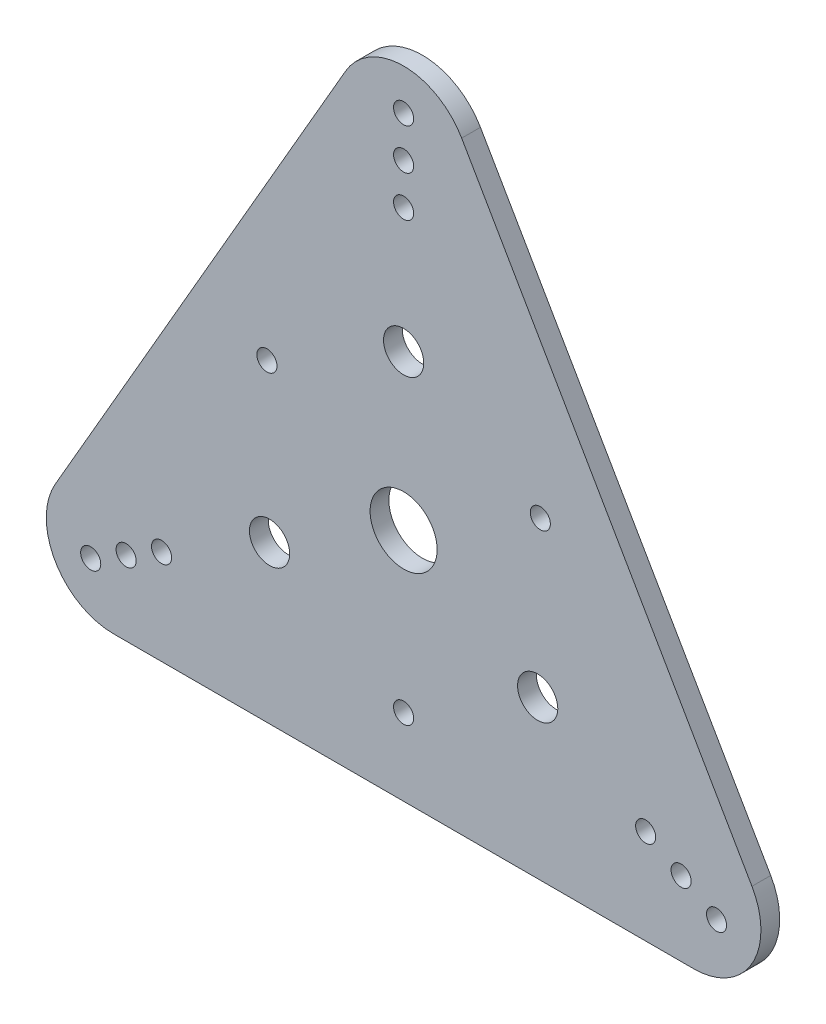
ISO-10303-21;
HEADER;
FILE_DESCRIPTION(('STEP AP214'),'2;1');
FILE_NAME('part.step','',(''),(''),'','','');
FILE_SCHEMA(('AUTOMOTIVE_DESIGN { 1 0 10303 214 1 1 1 1 }'));
ENDSEC;
DATA;
#1=APPLICATION_CONTEXT('core data for automotive mechanical design processes');
#2=APPLICATION_PROTOCOL_DEFINITION('international standard','automotive_design',2000,#1);
#3=PRODUCT_CONTEXT('',#1,'mechanical');
#4=PRODUCT('Part','Part','',(#3));
#5=PRODUCT_RELATED_PRODUCT_CATEGORY('part','',(#4));
#6=PRODUCT_DEFINITION_FORMATION('','',#4);
#7=PRODUCT_DEFINITION_CONTEXT('part definition',#1,'design');
#8=PRODUCT_DEFINITION('design','',#6,#7);
#9=PRODUCT_DEFINITION_SHAPE('','',#8);
#10=(LENGTH_UNIT() NAMED_UNIT(*) SI_UNIT(.MILLI.,.METRE.));
#11=(NAMED_UNIT(*) PLANE_ANGLE_UNIT() SI_UNIT($,.RADIAN.));
#12=(NAMED_UNIT(*) SI_UNIT($,.STERADIAN.) SOLID_ANGLE_UNIT());
#13=UNCERTAINTY_MEASURE_WITH_UNIT(LENGTH_MEASURE(1.E-05),#10,'distance_accuracy_value','');
#14=(GEOMETRIC_REPRESENTATION_CONTEXT(3) GLOBAL_UNCERTAINTY_ASSIGNED_CONTEXT((#13)) GLOBAL_UNIT_ASSIGNED_CONTEXT((#10,
#11,#12)) REPRESENTATION_CONTEXT('',''));
#15=CARTESIAN_POINT('',(0.,0.,0.));
#16=DIRECTION('',(0.,0.,1.));
#17=DIRECTION('',(1.,0.,0.));
#18=AXIS2_PLACEMENT_3D('',#15,#16,#17);
#19=CARTESIAN_POINT('',(-43.3012701892219,-37.5,2.8));
#20=DIRECTION('',(0.,0.,1.));
#21=DIRECTION('',(1.,0.,0.));
#22=AXIS2_PLACEMENT_3D('',#19,#20,#21);
#23=PLANE('',#22);
#24=CARTESIAN_POINT('',(19.9965265733827,-24.045,2.8));
#25=DIRECTION('',(0.,0.,1.));
#26=DIRECTION('',(1.,0.,0.));
#27=AXIS2_PLACEMENT_3D('',#24,#25,#26);
#28=CIRCLE('',#27,3.);
#29=CARTESIAN_POINT('',(22.9965265733827,-24.045,2.8));
#30=VERTEX_POINT('',#29);
#31=EDGE_CURVE('E240',#30,#30,#28,.T.);
#32=ORIENTED_EDGE('',*,*,#31,.F.);
#33=EDGE_LOOP('',(#32));
#34=FACE_BOUND('',#33,.T.);
#35=CARTESIAN_POINT('',(0.,10.59,2.8));
#36=DIRECTION('',(0.,0.,1.));
#37=DIRECTION('',(1.,0.,0.));
#38=AXIS2_PLACEMENT_3D('',#35,#36,#37);
#39=CIRCLE('',#38,3.);
#40=CARTESIAN_POINT('',(3.00000000000001,10.59,2.8));
#41=VERTEX_POINT('',#40);
#42=EDGE_CURVE('E252',#41,#41,#39,.T.);
#43=ORIENTED_EDGE('',*,*,#42,.F.);
#44=EDGE_LOOP('',(#43));
#45=FACE_BOUND('',#44,.T.);
#46=CARTESIAN_POINT('',(41.3916841738772,-36.3975,2.8));
#47=DIRECTION('',(0.,0.,1.));
#48=DIRECTION('',(1.,0.,0.));
#49=AXIS2_PLACEMENT_3D('',#46,#47,#48);
#50=CIRCLE('',#49,1.5);
#51=CARTESIAN_POINT('',(42.8916841738772,-36.3975,2.8));
#52=VERTEX_POINT('',#51);
#53=EDGE_CURVE('E264',#52,#52,#50,.T.);
#54=ORIENTED_EDGE('',*,*,#53,.F.);
#55=EDGE_LOOP('',(#54));
#56=FACE_BOUND('',#55,.T.);
#57=CARTESIAN_POINT('',(-36.1067641472827,-33.34625,2.8));
#58=DIRECTION('',(0.,0.,1.));
#59=DIRECTION('',(1.,0.,0.));
#60=AXIS2_PLACEMENT_3D('',#57,#58,#59);
#61=CIRCLE('',#60,1.5);
#62=CARTESIAN_POINT('',(-34.6067641472827,-33.34625,2.8));
#63=VERTEX_POINT('',#62);
#64=EDGE_CURVE('E276',#63,#63,#61,.T.);
#65=ORIENTED_EDGE('',*,*,#64,.F.);
#66=EDGE_LOOP('',(#65));
#67=FACE_BOUND('',#66,.T.);
#68=CARTESIAN_POINT('',(-46.6766042004718,-39.44875,2.8));
#69=DIRECTION('',(0.,0.,1.));
#70=DIRECTION('',(1.,0.,0.));
#71=AXIS2_PLACEMENT_3D('',#68,#69,#70);
#72=CIRCLE('',#71,1.5);
#73=CARTESIAN_POINT('',(-45.1766042004718,-39.44875,2.8));
#74=VERTEX_POINT('',#73);
#75=EDGE_CURVE('E288',#74,#74,#72,.T.);
#76=ORIENTED_EDGE('',*,*,#75,.F.);
#77=EDGE_LOOP('',(#76));
#78=FACE_BOUND('',#77,.T.);
#79=CARTESIAN_POINT('',(0.,35.295,2.8));
#80=DIRECTION('',(0.,0.,1.));
#81=DIRECTION('',(1.,0.,0.));
#82=AXIS2_PLACEMENT_3D('',#79,#80,#81);
#83=CIRCLE('',#82,1.5);
#84=CARTESIAN_POINT('',(1.49999999999999,35.295,2.8));
#85=VERTEX_POINT('',#84);
#86=EDGE_CURVE('E300',#85,#85,#83,.T.);
#87=ORIENTED_EDGE('',*,*,#86,.F.);
#88=EDGE_LOOP('',(#87));
#89=FACE_BOUND('',#88,.T.);
#90=CARTESIAN_POINT('',(-20.3905681321046,-0.727499999999985,2.8));
#91=DIRECTION('',(0.,0.,1.));
#92=DIRECTION('',(1.,0.,0.));
#93=AXIS2_PLACEMENT_3D('',#90,#91,#92);
#94=CIRCLE('',#93,1.5);
#95=CARTESIAN_POINT('',(-18.8905681321046,-0.727499999999985,2.8));
#96=VERTEX_POINT('',#95);
#97=EDGE_CURVE('E312',#96,#96,#94,.T.);
#98=ORIENTED_EDGE('',*,*,#97,.F.);
#99=EDGE_LOOP('',(#98));
#100=FACE_BOUND('',#99,.T.);
#101=CARTESIAN_POINT('',(0.,-36.045,2.8));
#102=DIRECTION('',(0.,0.,1.));
#103=DIRECTION('',(1.,0.,0.));
#104=AXIS2_PLACEMENT_3D('',#101,#102,#103);
#105=CIRCLE('',#104,1.5);
#106=CARTESIAN_POINT('',(1.49999999999998,-36.045,2.8));
#107=VERTEX_POINT('',#106);
#108=EDGE_CURVE('E125',#107,#107,#105,.T.);
#109=ORIENTED_EDGE('',*,*,#108,.F.);
#110=EDGE_LOOP('',(#109));
#111=FACE_BOUND('',#110,.T.);
#112=CARTESIAN_POINT('',(-43.3012701892219,-37.5,2.8));
#113=DIRECTION('',(0.,0.,1.));
#114=DIRECTION('',(1.,0.,0.));
#115=AXIS2_PLACEMENT_3D('',#112,#113,#114);
#116=CIRCLE('',#115,10.);
#117=CARTESIAN_POINT('',(-51.9615242270663,-32.5,2.8));
#118=VERTEX_POINT('',#117);
#119=CARTESIAN_POINT('',(-43.3012701892219,-47.5,2.8));
#120=VERTEX_POINT('',#119);
#121=EDGE_CURVE('E132',#118,#120,#116,.T.);
#122=ORIENTED_EDGE('',*,*,#121,.T.);
#123=DIRECTION('',(1.,0.,0.));
#124=VECTOR('',#123,1.);
#125=CARTESIAN_POINT('',(-43.3012701892219,-47.5,2.8));
#126=LINE('',#125,#124);
#127=CARTESIAN_POINT('',(43.3012701892219,-47.5,2.8));
#128=VERTEX_POINT('',#127);
#129=EDGE_CURVE('E90',#120,#128,#126,.T.);
#130=ORIENTED_EDGE('',*,*,#129,.T.);
#131=CARTESIAN_POINT('',(43.3012701892219,-37.5,2.8));
#132=DIRECTION('',(0.,0.,1.));
#133=DIRECTION('',(1.,0.,0.));
#134=AXIS2_PLACEMENT_3D('',#131,#132,#133);
#135=CIRCLE('',#134,10.);
#136=CARTESIAN_POINT('',(51.9615242270663,-32.5,2.8));
#137=VERTEX_POINT('',#136);
#138=EDGE_CURVE('E103',#128,#137,#135,.T.);
#139=ORIENTED_EDGE('',*,*,#138,.T.);
#140=DIRECTION('',(-0.5,0.866025403784439,0.));
#141=VECTOR('',#140,1.);
#142=CARTESIAN_POINT('',(51.9615242270663,-32.5,2.8));
#143=LINE('',#142,#141);
#144=CARTESIAN_POINT('',(8.66025403784438,42.5,2.8));
#145=VERTEX_POINT('',#144);
#146=EDGE_CURVE('E97',#137,#145,#143,.T.);
#147=ORIENTED_EDGE('',*,*,#146,.T.);
#148=CARTESIAN_POINT('',(0.,37.5,2.8));
#149=DIRECTION('',(0.,0.,1.));
#150=DIRECTION('',(1.,0.,0.));
#151=AXIS2_PLACEMENT_3D('',#148,#149,#150);
#152=CIRCLE('',#151,10.);
#153=CARTESIAN_POINT('',(-8.66025403784439,42.5,2.8));
#154=VERTEX_POINT('',#153);
#155=EDGE_CURVE('E101',#145,#154,#152,.T.);
#156=ORIENTED_EDGE('',*,*,#155,.T.);
#157=DIRECTION('',(-0.5,-0.866025403784439,0.));
#158=VECTOR('',#157,1.);
#159=CARTESIAN_POINT('',(-8.66025403784439,42.5,2.8));
#160=LINE('',#159,#158);
#161=EDGE_CURVE('E53',#154,#118,#160,.T.);
#162=ORIENTED_EDGE('',*,*,#161,.T.);
#163=EDGE_LOOP('',(#122,#130,#139,#147,#156,#162));
#164=FACE_BOUND('',#163,.T.);
#165=CARTESIAN_POINT('',(20.3905681321046,-0.727499999999985,2.8));
#166=DIRECTION('',(0.,0.,1.));
#167=DIRECTION('',(1.,0.,0.));
#168=AXIS2_PLACEMENT_3D('',#165,#166,#167);
#169=CIRCLE('',#168,1.5);
#170=CARTESIAN_POINT('',(21.8905681321046,-0.727499999999985,2.8));
#171=VERTEX_POINT('',#170);
#172=EDGE_CURVE('E318',#171,#171,#169,.T.);
#173=ORIENTED_EDGE('',*,*,#172,.F.);
#174=EDGE_LOOP('',(#173));
#175=FACE_BOUND('',#174,.T.);
#176=CARTESIAN_POINT('',(0.,41.3975,2.8));
#177=DIRECTION('',(0.,0.,1.));
#178=DIRECTION('',(1.,0.,0.));
#179=AXIS2_PLACEMENT_3D('',#176,#177,#178);
#180=CIRCLE('',#179,1.5);
#181=CARTESIAN_POINT('',(1.49999999999999,41.3975,2.8));
#182=VERTEX_POINT('',#181);
#183=EDGE_CURVE('E306',#182,#182,#180,.T.);
#184=ORIENTED_EDGE('',*,*,#183,.F.);
#185=EDGE_LOOP('',(#184));
#186=FACE_BOUND('',#185,.T.);
#187=CARTESIAN_POINT('',(0.,29.1925,2.8));
#188=DIRECTION('',(0.,0.,1.));
#189=DIRECTION('',(1.,0.,0.));
#190=AXIS2_PLACEMENT_3D('',#187,#188,#189);
#191=CIRCLE('',#190,1.5);
#192=CARTESIAN_POINT('',(1.49999999999999,29.1925,2.8));
#193=VERTEX_POINT('',#192);
#194=EDGE_CURVE('E294',#193,#193,#191,.T.);
#195=ORIENTED_EDGE('',*,*,#194,.F.);
#196=EDGE_LOOP('',(#195));
#197=FACE_BOUND('',#196,.T.);
#198=CARTESIAN_POINT('',(-41.3916841738772,-36.3975,2.8));
#199=DIRECTION('',(0.,0.,1.));
#200=DIRECTION('',(1.,0.,0.));
#201=AXIS2_PLACEMENT_3D('',#198,#199,#200);
#202=CIRCLE('',#201,1.49999999999999);
#203=CARTESIAN_POINT('',(-39.8916841738773,-36.3975,2.8));
#204=VERTEX_POINT('',#203);
#205=EDGE_CURVE('E282',#204,#204,#202,.T.);
#206=ORIENTED_EDGE('',*,*,#205,.F.);
#207=EDGE_LOOP('',(#206));
#208=FACE_BOUND('',#207,.T.);
#209=CARTESIAN_POINT('',(46.6766042004718,-39.44875,2.8));
#210=DIRECTION('',(0.,0.,1.));
#211=DIRECTION('',(1.,0.,0.));
#212=AXIS2_PLACEMENT_3D('',#209,#210,#211);
#213=CIRCLE('',#212,1.5);
#214=CARTESIAN_POINT('',(48.1766042004718,-39.44875,2.8));
#215=VERTEX_POINT('',#214);
#216=EDGE_CURVE('E270',#215,#215,#213,.T.);
#217=ORIENTED_EDGE('',*,*,#216,.F.);
#218=EDGE_LOOP('',(#217));
#219=FACE_BOUND('',#218,.T.);
#220=CARTESIAN_POINT('',(36.1067641472827,-33.34625,2.8));
#221=DIRECTION('',(0.,0.,1.));
#222=DIRECTION('',(1.,0.,0.));
#223=AXIS2_PLACEMENT_3D('',#220,#221,#222);
#224=CIRCLE('',#223,1.5);
#225=CARTESIAN_POINT('',(37.6067641472827,-33.34625,2.8));
#226=VERTEX_POINT('',#225);
#227=EDGE_CURVE('E258',#226,#226,#224,.T.);
#228=ORIENTED_EDGE('',*,*,#227,.F.);
#229=EDGE_LOOP('',(#228));
#230=FACE_BOUND('',#229,.T.);
#231=CARTESIAN_POINT('',(-19.9965265733827,-24.045,2.8));
#232=DIRECTION('',(0.,0.,1.));
#233=DIRECTION('',(1.,0.,0.));
#234=AXIS2_PLACEMENT_3D('',#231,#232,#233);
#235=CIRCLE('',#234,3.);
#236=CARTESIAN_POINT('',(-16.9965265733827,-24.045,2.8));
#237=VERTEX_POINT('',#236);
#238=EDGE_CURVE('E246',#237,#237,#235,.T.);
#239=ORIENTED_EDGE('',*,*,#238,.F.);
#240=EDGE_LOOP('',(#239));
#241=FACE_BOUND('',#240,.T.);
#242=CARTESIAN_POINT('',(0.,-12.5,2.8));
#243=DIRECTION('',(0.,0.,1.));
#244=DIRECTION('',(1.,0.,0.));
#245=AXIS2_PLACEMENT_3D('',#242,#243,#244);
#246=CIRCLE('',#245,5.);
#247=CARTESIAN_POINT('',(5.,-12.5,2.8));
#248=VERTEX_POINT('',#247);
#249=EDGE_CURVE('E231',#248,#248,#246,.T.);
#250=ORIENTED_EDGE('',*,*,#249,.F.);
#251=EDGE_LOOP('',(#250));
#252=FACE_BOUND('',#251,.T.);
#253=ADVANCED_FACE('F36',(#34,#45,#56,#67,#78,#89,#100,#111,#164,#175,#186,#197,#208,#219,#230,
#241,#252),#23,.T.);
#254=CARTESIAN_POINT('',(-43.3012701892219,-37.5,0.));
#255=DIRECTION('',(0.,0.,1.));
#256=DIRECTION('',(1.,0.,0.));
#257=AXIS2_PLACEMENT_3D('',#254,#255,#256);
#258=PLANE('',#257);
#259=CARTESIAN_POINT('',(-43.3012701892219,-37.5,0.));
#260=DIRECTION('',(0.,0.,1.));
#261=DIRECTION('',(1.,0.,0.));
#262=AXIS2_PLACEMENT_3D('',#259,#260,#261);
#263=CIRCLE('',#262,10.);
#264=CARTESIAN_POINT('',(-51.9615242270663,-32.5,0.));
#265=VERTEX_POINT('',#264);
#266=CARTESIAN_POINT('',(-43.3012701892219,-47.5,0.));
#267=VERTEX_POINT('',#266);
#268=EDGE_CURVE('E121',#265,#267,#263,.T.);
#269=ORIENTED_EDGE('',*,*,#268,.F.);
#270=DIRECTION('',(-0.5,-0.866025403784439,0.));
#271=VECTOR('',#270,1.);
#272=CARTESIAN_POINT('',(-8.66025403784439,42.5,0.));
#273=LINE('',#272,#271);
#274=CARTESIAN_POINT('',(-8.66025403784439,42.5,0.));
#275=VERTEX_POINT('',#274);
#276=EDGE_CURVE('E82',#275,#265,#273,.T.);
#277=ORIENTED_EDGE('',*,*,#276,.F.);
#278=CARTESIAN_POINT('',(0.,37.5,0.));
#279=DIRECTION('',(0.,0.,1.));
#280=DIRECTION('',(1.,0.,0.));
#281=AXIS2_PLACEMENT_3D('',#278,#279,#280);
#282=CIRCLE('',#281,10.);
#283=CARTESIAN_POINT('',(8.66025403784438,42.5,0.));
#284=VERTEX_POINT('',#283);
#285=EDGE_CURVE('E76',#284,#275,#282,.T.);
#286=ORIENTED_EDGE('',*,*,#285,.F.);
#287=DIRECTION('',(-0.5,0.866025403784439,0.));
#288=VECTOR('',#287,1.);
#289=CARTESIAN_POINT('',(51.9615242270663,-32.5,0.));
#290=LINE('',#289,#288);
#291=CARTESIAN_POINT('',(51.9615242270663,-32.5,0.));
#292=VERTEX_POINT('',#291);
#293=EDGE_CURVE('E111',#292,#284,#290,.T.);
#294=ORIENTED_EDGE('',*,*,#293,.F.);
#295=CARTESIAN_POINT('',(43.3012701892219,-37.5,0.));
#296=DIRECTION('',(0.,0.,1.));
#297=DIRECTION('',(1.,0.,0.));
#298=AXIS2_PLACEMENT_3D('',#295,#296,#297);
#299=CIRCLE('',#298,10.);
#300=CARTESIAN_POINT('',(43.3012701892219,-47.5,0.));
#301=VERTEX_POINT('',#300);
#302=EDGE_CURVE('E127',#301,#292,#299,.T.);
#303=ORIENTED_EDGE('',*,*,#302,.F.);
#304=DIRECTION('',(1.,0.,0.));
#305=VECTOR('',#304,1.);
#306=CARTESIAN_POINT('',(-43.3012701892219,-47.5,0.));
#307=LINE('',#306,#305);
#308=EDGE_CURVE('E124',#267,#301,#307,.T.);
#309=ORIENTED_EDGE('',*,*,#308,.F.);
#310=EDGE_LOOP('',(#269,#277,#286,#294,#303,#309));
#311=FACE_BOUND('',#310,.T.);
#312=CARTESIAN_POINT('',(0.,-36.045,0.));
#313=DIRECTION('',(0.,0.,1.));
#314=DIRECTION('',(1.,0.,0.));
#315=AXIS2_PLACEMENT_3D('',#312,#313,#314);
#316=CIRCLE('',#315,1.5);
#317=CARTESIAN_POINT('',(1.49999999999998,-36.045,0.));
#318=VERTEX_POINT('',#317);
#319=EDGE_CURVE('E321',#318,#318,#316,.T.);
#320=ORIENTED_EDGE('',*,*,#319,.T.);
#321=EDGE_LOOP('',(#320));
#322=FACE_BOUND('',#321,.T.);
#323=CARTESIAN_POINT('',(20.3905681321046,-0.727499999999985,0.));
#324=DIRECTION('',(0.,0.,1.));
#325=DIRECTION('',(1.,0.,0.));
#326=AXIS2_PLACEMENT_3D('',#323,#324,#325);
#327=CIRCLE('',#326,1.5);
#328=CARTESIAN_POINT('',(21.8905681321046,-0.727499999999985,0.));
#329=VERTEX_POINT('',#328);
#330=EDGE_CURVE('E315',#329,#329,#327,.T.);
#331=ORIENTED_EDGE('',*,*,#330,.T.);
#332=EDGE_LOOP('',(#331));
#333=FACE_BOUND('',#332,.T.);
#334=CARTESIAN_POINT('',(-20.3905681321046,-0.727499999999985,0.));
#335=DIRECTION('',(0.,0.,1.));
#336=DIRECTION('',(1.,0.,0.));
#337=AXIS2_PLACEMENT_3D('',#334,#335,#336);
#338=CIRCLE('',#337,1.5);
#339=CARTESIAN_POINT('',(-18.8905681321046,-0.727499999999985,0.));
#340=VERTEX_POINT('',#339);
#341=EDGE_CURVE('E309',#340,#340,#338,.T.);
#342=ORIENTED_EDGE('',*,*,#341,.T.);
#343=EDGE_LOOP('',(#342));
#344=FACE_BOUND('',#343,.T.);
#345=CARTESIAN_POINT('',(0.,41.3975,0.));
#346=DIRECTION('',(0.,0.,1.));
#347=DIRECTION('',(1.,0.,0.));
#348=AXIS2_PLACEMENT_3D('',#345,#346,#347);
#349=CIRCLE('',#348,1.5);
#350=CARTESIAN_POINT('',(1.49999999999999,41.3975,0.));
#351=VERTEX_POINT('',#350);
#352=EDGE_CURVE('E303',#351,#351,#349,.T.);
#353=ORIENTED_EDGE('',*,*,#352,.T.);
#354=EDGE_LOOP('',(#353));
#355=FACE_BOUND('',#354,.T.);
#356=CARTESIAN_POINT('',(0.,35.295,0.));
#357=DIRECTION('',(0.,0.,1.));
#358=DIRECTION('',(1.,0.,0.));
#359=AXIS2_PLACEMENT_3D('',#356,#357,#358);
#360=CIRCLE('',#359,1.5);
#361=CARTESIAN_POINT('',(1.49999999999999,35.295,0.));
#362=VERTEX_POINT('',#361);
#363=EDGE_CURVE('E297',#362,#362,#360,.T.);
#364=ORIENTED_EDGE('',*,*,#363,.T.);
#365=EDGE_LOOP('',(#364));
#366=FACE_BOUND('',#365,.T.);
#367=CARTESIAN_POINT('',(0.,29.1925,0.));
#368=DIRECTION('',(0.,0.,1.));
#369=DIRECTION('',(1.,0.,0.));
#370=AXIS2_PLACEMENT_3D('',#367,#368,#369);
#371=CIRCLE('',#370,1.5);
#372=CARTESIAN_POINT('',(1.49999999999999,29.1925,0.));
#373=VERTEX_POINT('',#372);
#374=EDGE_CURVE('E291',#373,#373,#371,.T.);
#375=ORIENTED_EDGE('',*,*,#374,.T.);
#376=EDGE_LOOP('',(#375));
#377=FACE_BOUND('',#376,.T.);
#378=CARTESIAN_POINT('',(-46.6766042004718,-39.44875,0.));
#379=DIRECTION('',(0.,0.,1.));
#380=DIRECTION('',(1.,0.,0.));
#381=AXIS2_PLACEMENT_3D('',#378,#379,#380);
#382=CIRCLE('',#381,1.5);
#383=CARTESIAN_POINT('',(-45.1766042004718,-39.44875,0.));
#384=VERTEX_POINT('',#383);
#385=EDGE_CURVE('E285',#384,#384,#382,.T.);
#386=ORIENTED_EDGE('',*,*,#385,.T.);
#387=EDGE_LOOP('',(#386));
#388=FACE_BOUND('',#387,.T.);
#389=CARTESIAN_POINT('',(-41.3916841738772,-36.3975,0.));
#390=DIRECTION('',(0.,0.,1.));
#391=DIRECTION('',(1.,0.,0.));
#392=AXIS2_PLACEMENT_3D('',#389,#390,#391);
#393=CIRCLE('',#392,1.49999999999999);
#394=CARTESIAN_POINT('',(-39.8916841738773,-36.3975,0.));
#395=VERTEX_POINT('',#394);
#396=EDGE_CURVE('E279',#395,#395,#393,.T.);
#397=ORIENTED_EDGE('',*,*,#396,.T.);
#398=EDGE_LOOP('',(#397));
#399=FACE_BOUND('',#398,.T.);
#400=CARTESIAN_POINT('',(-36.1067641472827,-33.34625,0.));
#401=DIRECTION('',(0.,0.,1.));
#402=DIRECTION('',(1.,0.,0.));
#403=AXIS2_PLACEMENT_3D('',#400,#401,#402);
#404=CIRCLE('',#403,1.5);
#405=CARTESIAN_POINT('',(-34.6067641472827,-33.34625,0.));
#406=VERTEX_POINT('',#405);
#407=EDGE_CURVE('E273',#406,#406,#404,.T.);
#408=ORIENTED_EDGE('',*,*,#407,.T.);
#409=EDGE_LOOP('',(#408));
#410=FACE_BOUND('',#409,.T.);
#411=CARTESIAN_POINT('',(46.6766042004718,-39.44875,0.));
#412=DIRECTION('',(0.,0.,1.));
#413=DIRECTION('',(1.,0.,0.));
#414=AXIS2_PLACEMENT_3D('',#411,#412,#413);
#415=CIRCLE('',#414,1.5);
#416=CARTESIAN_POINT('',(48.1766042004718,-39.44875,0.));
#417=VERTEX_POINT('',#416);
#418=EDGE_CURVE('E267',#417,#417,#415,.T.);
#419=ORIENTED_EDGE('',*,*,#418,.T.);
#420=EDGE_LOOP('',(#419));
#421=FACE_BOUND('',#420,.T.);
#422=CARTESIAN_POINT('',(41.3916841738772,-36.3975,0.));
#423=DIRECTION('',(0.,0.,1.));
#424=DIRECTION('',(1.,0.,0.));
#425=AXIS2_PLACEMENT_3D('',#422,#423,#424);
#426=CIRCLE('',#425,1.5);
#427=CARTESIAN_POINT('',(42.8916841738772,-36.3975,0.));
#428=VERTEX_POINT('',#427);
#429=EDGE_CURVE('E261',#428,#428,#426,.T.);
#430=ORIENTED_EDGE('',*,*,#429,.T.);
#431=EDGE_LOOP('',(#430));
#432=FACE_BOUND('',#431,.T.);
#433=CARTESIAN_POINT('',(36.1067641472827,-33.34625,0.));
#434=DIRECTION('',(0.,0.,1.));
#435=DIRECTION('',(1.,0.,0.));
#436=AXIS2_PLACEMENT_3D('',#433,#434,#435);
#437=CIRCLE('',#436,1.5);
#438=CARTESIAN_POINT('',(37.6067641472827,-33.34625,0.));
#439=VERTEX_POINT('',#438);
#440=EDGE_CURVE('E255',#439,#439,#437,.T.);
#441=ORIENTED_EDGE('',*,*,#440,.T.);
#442=EDGE_LOOP('',(#441));
#443=FACE_BOUND('',#442,.T.);
#444=CARTESIAN_POINT('',(0.,10.59,0.));
#445=DIRECTION('',(0.,0.,1.));
#446=DIRECTION('',(1.,0.,0.));
#447=AXIS2_PLACEMENT_3D('',#444,#445,#446);
#448=CIRCLE('',#447,3.);
#449=CARTESIAN_POINT('',(3.00000000000001,10.59,0.));
#450=VERTEX_POINT('',#449);
#451=EDGE_CURVE('E249',#450,#450,#448,.T.);
#452=ORIENTED_EDGE('',*,*,#451,.T.);
#453=EDGE_LOOP('',(#452));
#454=FACE_BOUND('',#453,.T.);
#455=CARTESIAN_POINT('',(-19.9965265733827,-24.045,0.));
#456=DIRECTION('',(0.,0.,1.));
#457=DIRECTION('',(1.,0.,0.));
#458=AXIS2_PLACEMENT_3D('',#455,#456,#457);
#459=CIRCLE('',#458,3.);
#460=CARTESIAN_POINT('',(-16.9965265733827,-24.045,0.));
#461=VERTEX_POINT('',#460);
#462=EDGE_CURVE('E243',#461,#461,#459,.T.);
#463=ORIENTED_EDGE('',*,*,#462,.T.);
#464=EDGE_LOOP('',(#463));
#465=FACE_BOUND('',#464,.T.);
#466=CARTESIAN_POINT('',(19.9965265733827,-24.045,0.));
#467=DIRECTION('',(0.,0.,1.));
#468=DIRECTION('',(1.,0.,0.));
#469=AXIS2_PLACEMENT_3D('',#466,#467,#468);
#470=CIRCLE('',#469,3.);
#471=CARTESIAN_POINT('',(22.9965265733827,-24.045,0.));
#472=VERTEX_POINT('',#471);
#473=EDGE_CURVE('E237',#472,#472,#470,.T.);
#474=ORIENTED_EDGE('',*,*,#473,.T.);
#475=EDGE_LOOP('',(#474));
#476=FACE_BOUND('',#475,.T.);
#477=CARTESIAN_POINT('',(0.,-12.5,0.));
#478=DIRECTION('',(0.,0.,1.));
#479=DIRECTION('',(1.,0.,0.));
#480=AXIS2_PLACEMENT_3D('',#477,#478,#479);
#481=CIRCLE('',#480,5.);
#482=CARTESIAN_POINT('',(5.,-12.5,0.));
#483=VERTEX_POINT('',#482);
#484=EDGE_CURVE('E234',#483,#483,#481,.T.);
#485=ORIENTED_EDGE('',*,*,#484,.T.);
#486=EDGE_LOOP('',(#485));
#487=FACE_BOUND('',#486,.T.);
#488=ADVANCED_FACE('F141',(#311,#322,#333,#344,#355,#366,#377,#388,#399,#410,#421,#432,#443,
#454,#465,#476,#487),#258,.F.);
#489=CARTESIAN_POINT('',(-43.3012701892219,-37.5,2.8));
#490=DIRECTION('',(0.,0.,-1.));
#491=DIRECTION('',(-1.,0.,0.));
#492=AXIS2_PLACEMENT_3D('',#489,#490,#491);
#493=CYLINDRICAL_SURFACE('',#492,10.);
#494=ORIENTED_EDGE('',*,*,#268,.T.);
#495=DIRECTION('',(0.,0.,-1.));
#496=VECTOR('',#495,1.);
#497=CARTESIAN_POINT('',(-43.3012701892219,-47.5,2.8));
#498=LINE('',#497,#496);
#499=EDGE_CURVE('E11',#120,#267,#498,.T.);
#500=ORIENTED_EDGE('',*,*,#499,.F.);
#501=ORIENTED_EDGE('',*,*,#121,.F.);
#502=DIRECTION('',(0.,0.,-1.));
#503=VECTOR('',#502,1.);
#504=CARTESIAN_POINT('',(-51.9615242270663,-32.5,2.8));
#505=LINE('',#504,#503);
#506=EDGE_CURVE('E117',#118,#265,#505,.T.);
#507=ORIENTED_EDGE('',*,*,#506,.T.);
#508=EDGE_LOOP('',(#494,#500,#501,#507));
#509=FACE_BOUND('',#508,.T.);
#510=ADVANCED_FACE('F38',(#509),#493,.T.);
#511=CARTESIAN_POINT('',(-43.3012701892219,-47.5,2.8));
#512=DIRECTION('',(0.,1.,0.));
#513=DIRECTION('',(-1.,0.,0.));
#514=AXIS2_PLACEMENT_3D('',#511,#512,#513);
#515=PLANE('',#514);
#516=ORIENTED_EDGE('',*,*,#308,.T.);
#517=DIRECTION('',(0.,0.,-1.));
#518=VECTOR('',#517,1.);
#519=CARTESIAN_POINT('',(43.3012701892219,-47.5,2.8));
#520=LINE('',#519,#518);
#521=EDGE_CURVE('E45',#128,#301,#520,.T.);
#522=ORIENTED_EDGE('',*,*,#521,.F.);
#523=ORIENTED_EDGE('',*,*,#129,.F.);
#524=ORIENTED_EDGE('',*,*,#499,.T.);
#525=EDGE_LOOP('',(#516,#522,#523,#524));
#526=FACE_BOUND('',#525,.T.);
#527=ADVANCED_FACE('F504',(#526),#515,.F.);
#528=CARTESIAN_POINT('',(43.3012701892219,-37.5,2.8));
#529=DIRECTION('',(0.,0.,-1.));
#530=DIRECTION('',(-1.,0.,0.));
#531=AXIS2_PLACEMENT_3D('',#528,#529,#530);
#532=CYLINDRICAL_SURFACE('',#531,10.);
#533=ORIENTED_EDGE('',*,*,#302,.T.);
#534=DIRECTION('',(0.,0.,-1.));
#535=VECTOR('',#534,1.);
#536=CARTESIAN_POINT('',(51.9615242270663,-32.5,2.8));
#537=LINE('',#536,#535);
#538=EDGE_CURVE('E112',#137,#292,#537,.T.);
#539=ORIENTED_EDGE('',*,*,#538,.F.);
#540=ORIENTED_EDGE('',*,*,#138,.F.);
#541=ORIENTED_EDGE('',*,*,#521,.T.);
#542=EDGE_LOOP('',(#533,#539,#540,#541));
#543=FACE_BOUND('',#542,.T.);
#544=ADVANCED_FACE('F138',(#543),#532,.T.);
#545=CARTESIAN_POINT('',(51.9615242270663,-32.5,2.8));
#546=DIRECTION('',(-0.866025403784439,-0.5,0.));
#547=DIRECTION('',(0.5,-0.866025403784439,0.));
#548=AXIS2_PLACEMENT_3D('',#545,#546,#547);
#549=PLANE('',#548);
#550=ORIENTED_EDGE('',*,*,#293,.T.);
#551=DIRECTION('',(0.,0.,-1.));
#552=VECTOR('',#551,1.);
#553=CARTESIAN_POINT('',(8.66025403784438,42.5,2.8));
#554=LINE('',#553,#552);
#555=EDGE_CURVE('E108',#145,#284,#554,.T.);
#556=ORIENTED_EDGE('',*,*,#555,.F.);
#557=ORIENTED_EDGE('',*,*,#146,.F.);
#558=ORIENTED_EDGE('',*,*,#538,.T.);
#559=EDGE_LOOP('',(#550,#556,#557,#558));
#560=FACE_BOUND('',#559,.T.);
#561=ADVANCED_FACE('F109',(#560),#549,.F.);
#562=CARTESIAN_POINT('',(0.,37.5,2.8));
#563=DIRECTION('',(0.,0.,-1.));
#564=DIRECTION('',(-1.,0.,0.));
#565=AXIS2_PLACEMENT_3D('',#562,#563,#564);
#566=CYLINDRICAL_SURFACE('',#565,10.);
#567=ORIENTED_EDGE('',*,*,#285,.T.);
#568=DIRECTION('',(0.,0.,-1.));
#569=VECTOR('',#568,1.);
#570=CARTESIAN_POINT('',(-8.66025403784439,42.5,2.8));
#571=LINE('',#570,#569);
#572=EDGE_CURVE('E113',#154,#275,#571,.T.);
#573=ORIENTED_EDGE('',*,*,#572,.F.);
#574=ORIENTED_EDGE('',*,*,#155,.F.);
#575=ORIENTED_EDGE('',*,*,#555,.T.);
#576=EDGE_LOOP('',(#567,#573,#574,#575));
#577=FACE_BOUND('',#576,.T.);
#578=ADVANCED_FACE('F115',(#577),#566,.T.);
#579=CARTESIAN_POINT('',(-8.66025403784439,42.5,2.8));
#580=DIRECTION('',(0.866025403784439,-0.5,0.));
#581=DIRECTION('',(0.5,0.866025403784439,0.));
#582=AXIS2_PLACEMENT_3D('',#579,#580,#581);
#583=PLANE('',#582);
#584=ORIENTED_EDGE('',*,*,#276,.T.);
#585=ORIENTED_EDGE('',*,*,#506,.F.);
#586=ORIENTED_EDGE('',*,*,#161,.F.);
#587=ORIENTED_EDGE('',*,*,#572,.T.);
#588=EDGE_LOOP('',(#584,#585,#586,#587));
#589=FACE_BOUND('',#588,.T.);
#590=ADVANCED_FACE('F146',(#589),#583,.F.);
#591=CARTESIAN_POINT('',(0.,-36.045,2.8));
#592=DIRECTION('',(0.,0.,-1.));
#593=DIRECTION('',(-1.,0.,0.));
#594=AXIS2_PLACEMENT_3D('',#591,#592,#593);
#595=CYLINDRICAL_SURFACE('',#594,1.5);
#596=ORIENTED_EDGE('',*,*,#108,.T.);
#597=EDGE_LOOP('',(#596));
#598=FACE_BOUND('',#597,.T.);
#599=ORIENTED_EDGE('',*,*,#319,.F.);
#600=EDGE_LOOP('',(#599));
#601=FACE_BOUND('',#600,.T.);
#602=ADVANCED_FACE('F148',(#598,#601),#595,.F.);
#603=CARTESIAN_POINT('',(20.3905681321046,-0.727499999999985,2.8));
#604=DIRECTION('',(0.,0.,-1.));
#605=DIRECTION('',(-1.,0.,0.));
#606=AXIS2_PLACEMENT_3D('',#603,#604,#605);
#607=CYLINDRICAL_SURFACE('',#606,1.5);
#608=ORIENTED_EDGE('',*,*,#172,.T.);
#609=EDGE_LOOP('',(#608));
#610=FACE_BOUND('',#609,.T.);
#611=ORIENTED_EDGE('',*,*,#330,.F.);
#612=EDGE_LOOP('',(#611));
#613=FACE_BOUND('',#612,.T.);
#614=ADVANCED_FACE('F154',(#610,#613),#607,.F.);
#615=CARTESIAN_POINT('',(-20.3905681321046,-0.727499999999985,2.8));
#616=DIRECTION('',(0.,0.,-1.));
#617=DIRECTION('',(-1.,0.,0.));
#618=AXIS2_PLACEMENT_3D('',#615,#616,#617);
#619=CYLINDRICAL_SURFACE('',#618,1.5);
#620=ORIENTED_EDGE('',*,*,#97,.T.);
#621=EDGE_LOOP('',(#620));
#622=FACE_BOUND('',#621,.T.);
#623=ORIENTED_EDGE('',*,*,#341,.F.);
#624=EDGE_LOOP('',(#623));
#625=FACE_BOUND('',#624,.T.);
#626=ADVANCED_FACE('F170',(#622,#625),#619,.F.);
#627=CARTESIAN_POINT('',(0.,41.3975,2.8));
#628=DIRECTION('',(0.,0.,-1.));
#629=DIRECTION('',(-1.,0.,0.));
#630=AXIS2_PLACEMENT_3D('',#627,#628,#629);
#631=CYLINDRICAL_SURFACE('',#630,1.5);
#632=ORIENTED_EDGE('',*,*,#183,.T.);
#633=EDGE_LOOP('',(#632));
#634=FACE_BOUND('',#633,.T.);
#635=ORIENTED_EDGE('',*,*,#352,.F.);
#636=EDGE_LOOP('',(#635));
#637=FACE_BOUND('',#636,.T.);
#638=ADVANCED_FACE('F174',(#634,#637),#631,.F.);
#639=CARTESIAN_POINT('',(0.,35.295,2.8));
#640=DIRECTION('',(0.,0.,-1.));
#641=DIRECTION('',(-1.,0.,0.));
#642=AXIS2_PLACEMENT_3D('',#639,#640,#641);
#643=CYLINDRICAL_SURFACE('',#642,1.5);
#644=ORIENTED_EDGE('',*,*,#86,.T.);
#645=EDGE_LOOP('',(#644));
#646=FACE_BOUND('',#645,.T.);
#647=ORIENTED_EDGE('',*,*,#363,.F.);
#648=EDGE_LOOP('',(#647));
#649=FACE_BOUND('',#648,.T.);
#650=ADVANCED_FACE('F178',(#646,#649),#643,.F.);
#651=CARTESIAN_POINT('',(0.,29.1925,2.8));
#652=DIRECTION('',(0.,0.,-1.));
#653=DIRECTION('',(-1.,0.,0.));
#654=AXIS2_PLACEMENT_3D('',#651,#652,#653);
#655=CYLINDRICAL_SURFACE('',#654,1.5);
#656=ORIENTED_EDGE('',*,*,#194,.T.);
#657=EDGE_LOOP('',(#656));
#658=FACE_BOUND('',#657,.T.);
#659=ORIENTED_EDGE('',*,*,#374,.F.);
#660=EDGE_LOOP('',(#659));
#661=FACE_BOUND('',#660,.T.);
#662=ADVANCED_FACE('F182',(#658,#661),#655,.F.);
#663=CARTESIAN_POINT('',(-46.6766042004718,-39.44875,2.8));
#664=DIRECTION('',(0.,0.,-1.));
#665=DIRECTION('',(-1.,0.,0.));
#666=AXIS2_PLACEMENT_3D('',#663,#664,#665);
#667=CYLINDRICAL_SURFACE('',#666,1.5);
#668=ORIENTED_EDGE('',*,*,#75,.T.);
#669=EDGE_LOOP('',(#668));
#670=FACE_BOUND('',#669,.T.);
#671=ORIENTED_EDGE('',*,*,#385,.F.);
#672=EDGE_LOOP('',(#671));
#673=FACE_BOUND('',#672,.T.);
#674=ADVANCED_FACE('F186',(#670,#673),#667,.F.);
#675=CARTESIAN_POINT('',(-41.3916841738772,-36.3975,2.8));
#676=DIRECTION('',(0.,0.,-1.));
#677=DIRECTION('',(-1.,0.,0.));
#678=AXIS2_PLACEMENT_3D('',#675,#676,#677);
#679=CYLINDRICAL_SURFACE('',#678,1.49999999999999);
#680=ORIENTED_EDGE('',*,*,#205,.T.);
#681=EDGE_LOOP('',(#680));
#682=FACE_BOUND('',#681,.T.);
#683=ORIENTED_EDGE('',*,*,#396,.F.);
#684=EDGE_LOOP('',(#683));
#685=FACE_BOUND('',#684,.T.);
#686=ADVANCED_FACE('F190',(#682,#685),#679,.F.);
#687=CARTESIAN_POINT('',(-36.1067641472827,-33.34625,2.8));
#688=DIRECTION('',(0.,0.,-1.));
#689=DIRECTION('',(-1.,0.,0.));
#690=AXIS2_PLACEMENT_3D('',#687,#688,#689);
#691=CYLINDRICAL_SURFACE('',#690,1.5);
#692=ORIENTED_EDGE('',*,*,#64,.T.);
#693=EDGE_LOOP('',(#692));
#694=FACE_BOUND('',#693,.T.);
#695=ORIENTED_EDGE('',*,*,#407,.F.);
#696=EDGE_LOOP('',(#695));
#697=FACE_BOUND('',#696,.T.);
#698=ADVANCED_FACE('F194',(#694,#697),#691,.F.);
#699=CARTESIAN_POINT('',(46.6766042004718,-39.44875,2.8));
#700=DIRECTION('',(0.,0.,-1.));
#701=DIRECTION('',(-1.,0.,0.));
#702=AXIS2_PLACEMENT_3D('',#699,#700,#701);
#703=CYLINDRICAL_SURFACE('',#702,1.5);
#704=ORIENTED_EDGE('',*,*,#216,.T.);
#705=EDGE_LOOP('',(#704));
#706=FACE_BOUND('',#705,.T.);
#707=ORIENTED_EDGE('',*,*,#418,.F.);
#708=EDGE_LOOP('',(#707));
#709=FACE_BOUND('',#708,.T.);
#710=ADVANCED_FACE('F198',(#706,#709),#703,.F.);
#711=CARTESIAN_POINT('',(41.3916841738772,-36.3975,2.8));
#712=DIRECTION('',(0.,0.,-1.));
#713=DIRECTION('',(-1.,0.,0.));
#714=AXIS2_PLACEMENT_3D('',#711,#712,#713);
#715=CYLINDRICAL_SURFACE('',#714,1.5);
#716=ORIENTED_EDGE('',*,*,#53,.T.);
#717=EDGE_LOOP('',(#716));
#718=FACE_BOUND('',#717,.T.);
#719=ORIENTED_EDGE('',*,*,#429,.F.);
#720=EDGE_LOOP('',(#719));
#721=FACE_BOUND('',#720,.T.);
#722=ADVANCED_FACE('F202',(#718,#721),#715,.F.);
#723=CARTESIAN_POINT('',(36.1067641472827,-33.34625,2.8));
#724=DIRECTION('',(0.,0.,-1.));
#725=DIRECTION('',(-1.,0.,0.));
#726=AXIS2_PLACEMENT_3D('',#723,#724,#725);
#727=CYLINDRICAL_SURFACE('',#726,1.5);
#728=ORIENTED_EDGE('',*,*,#227,.T.);
#729=EDGE_LOOP('',(#728));
#730=FACE_BOUND('',#729,.T.);
#731=ORIENTED_EDGE('',*,*,#440,.F.);
#732=EDGE_LOOP('',(#731));
#733=FACE_BOUND('',#732,.T.);
#734=ADVANCED_FACE('F206',(#730,#733),#727,.F.);
#735=CARTESIAN_POINT('',(0.,10.59,2.8));
#736=DIRECTION('',(0.,0.,-1.));
#737=DIRECTION('',(-1.,0.,0.));
#738=AXIS2_PLACEMENT_3D('',#735,#736,#737);
#739=CYLINDRICAL_SURFACE('',#738,3.);
#740=ORIENTED_EDGE('',*,*,#42,.T.);
#741=EDGE_LOOP('',(#740));
#742=FACE_BOUND('',#741,.T.);
#743=ORIENTED_EDGE('',*,*,#451,.F.);
#744=EDGE_LOOP('',(#743));
#745=FACE_BOUND('',#744,.T.);
#746=ADVANCED_FACE('F210',(#742,#745),#739,.F.);
#747=CARTESIAN_POINT('',(-19.9965265733827,-24.045,2.8));
#748=DIRECTION('',(0.,0.,-1.));
#749=DIRECTION('',(-1.,0.,0.));
#750=AXIS2_PLACEMENT_3D('',#747,#748,#749);
#751=CYLINDRICAL_SURFACE('',#750,3.);
#752=ORIENTED_EDGE('',*,*,#238,.T.);
#753=EDGE_LOOP('',(#752));
#754=FACE_BOUND('',#753,.T.);
#755=ORIENTED_EDGE('',*,*,#462,.F.);
#756=EDGE_LOOP('',(#755));
#757=FACE_BOUND('',#756,.T.);
#758=ADVANCED_FACE('F214',(#754,#757),#751,.F.);
#759=CARTESIAN_POINT('',(19.9965265733827,-24.045,2.8));
#760=DIRECTION('',(0.,0.,-1.));
#761=DIRECTION('',(-1.,0.,0.));
#762=AXIS2_PLACEMENT_3D('',#759,#760,#761);
#763=CYLINDRICAL_SURFACE('',#762,3.);
#764=ORIENTED_EDGE('',*,*,#31,.T.);
#765=EDGE_LOOP('',(#764));
#766=FACE_BOUND('',#765,.T.);
#767=ORIENTED_EDGE('',*,*,#473,.F.);
#768=EDGE_LOOP('',(#767));
#769=FACE_BOUND('',#768,.T.);
#770=ADVANCED_FACE('F218',(#766,#769),#763,.F.);
#771=CARTESIAN_POINT('',(0.,-12.5,2.8));
#772=DIRECTION('',(0.,0.,-1.));
#773=DIRECTION('',(-1.,0.,0.));
#774=AXIS2_PLACEMENT_3D('',#771,#772,#773);
#775=CYLINDRICAL_SURFACE('',#774,5.);
#776=ORIENTED_EDGE('',*,*,#249,.T.);
#777=EDGE_LOOP('',(#776));
#778=FACE_BOUND('',#777,.T.);
#779=ORIENTED_EDGE('',*,*,#484,.F.);
#780=EDGE_LOOP('',(#779));
#781=FACE_BOUND('',#780,.T.);
#782=ADVANCED_FACE('F222',(#778,#781),#775,.F.);
#783=CLOSED_SHELL('',(#253,#488,#510,#527,#544,#561,#578,#590,#602,#614,#626,#638,#650,#662,
#674,#686,#698,#710,#722,#734,#746,#758,#770,#782));
#784=MANIFOLD_SOLID_BREP('B2',#783);
#785=ADVANCED_BREP_SHAPE_REPRESENTATION('',(#18,#784),#14);
#786=SHAPE_DEFINITION_REPRESENTATION(#9,#785);
ENDSEC;
END-ISO-10303-21;
